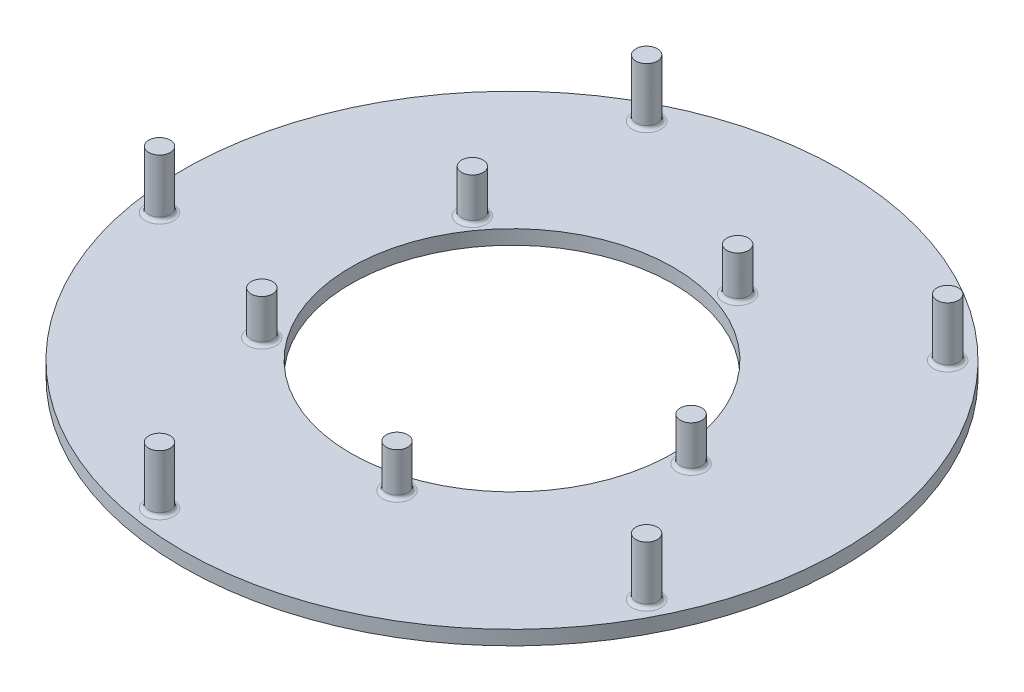
ISO-10303-21;
HEADER;
FILE_DESCRIPTION(('STEP AP214'),'2;1');
FILE_NAME('part.step','',(''),(''),'','','');
FILE_SCHEMA(('AUTOMOTIVE_DESIGN { 1 0 10303 214 1 1 1 1 }'));
ENDSEC;
DATA;
#1=APPLICATION_CONTEXT('core data for automotive mechanical design processes');
#2=APPLICATION_PROTOCOL_DEFINITION('international standard','automotive_design',2000,#1);
#3=PRODUCT_CONTEXT('',#1,'mechanical');
#4=PRODUCT('Part','Part','',(#3));
#5=PRODUCT_RELATED_PRODUCT_CATEGORY('part','',(#4));
#6=PRODUCT_DEFINITION_FORMATION('','',#4);
#7=PRODUCT_DEFINITION_CONTEXT('part definition',#1,'design');
#8=PRODUCT_DEFINITION('design','',#6,#7);
#9=PRODUCT_DEFINITION_SHAPE('','',#8);
#10=(LENGTH_UNIT() NAMED_UNIT(*) SI_UNIT(.MILLI.,.METRE.));
#11=(NAMED_UNIT(*) PLANE_ANGLE_UNIT() SI_UNIT($,.RADIAN.));
#12=(NAMED_UNIT(*) SI_UNIT($,.STERADIAN.) SOLID_ANGLE_UNIT());
#13=UNCERTAINTY_MEASURE_WITH_UNIT(LENGTH_MEASURE(1.E-05),#10,'distance_accuracy_value','');
#14=(GEOMETRIC_REPRESENTATION_CONTEXT(3) GLOBAL_UNCERTAINTY_ASSIGNED_CONTEXT((#13)) GLOBAL_UNIT_ASSIGNED_CONTEXT((#10,
#11,#12)) REPRESENTATION_CONTEXT('',''));
#15=CARTESIAN_POINT('',(0.,0.,0.));
#16=DIRECTION('',(0.,0.,1.));
#17=DIRECTION('',(1.,0.,0.));
#18=AXIS2_PLACEMENT_3D('',#15,#16,#17);
#19=CARTESIAN_POINT('',(0.,2.,0.));
#20=DIRECTION('',(0.,1.,0.));
#21=DIRECTION('',(0.,0.,1.));
#22=AXIS2_PLACEMENT_3D('',#19,#20,#21);
#23=PLANE('',#22);
#24=CARTESIAN_POINT('',(38.3132805401001,2.,19.5215914888));
#25=DIRECTION('',(0.,1.,0.));
#26=DIRECTION('',(0.,0.,1.));
#27=AXIS2_PLACEMENT_3D('',#24,#25,#26);
#28=CIRCLE('',#27,2.00000000000001);
#29=CARTESIAN_POINT('',(38.3132805401001,2.,21.5215914888));
#30=VERTEX_POINT('',#29);
#31=EDGE_CURVE('E38',#30,#30,#28,.F.);
#32=ORIENTED_EDGE('',*,*,#31,.T.);
#33=EDGE_LOOP('',(#32));
#34=FACE_BOUND('',#33,.T.);
#35=CARTESIAN_POINT('',(7.72542485937396,2.,23.7764129073788));
#36=DIRECTION('',(0.,1.,0.));
#37=DIRECTION('',(0.,0.,1.));
#38=AXIS2_PLACEMENT_3D('',#35,#36,#37);
#39=CIRCLE('',#38,2.);
#40=CARTESIAN_POINT('',(7.72542485937396,2.,25.7764129073788));
#41=VERTEX_POINT('',#40);
#42=EDGE_CURVE('E42',#41,#41,#39,.F.);
#43=ORIENTED_EDGE('',*,*,#42,.T.);
#44=EDGE_LOOP('',(#43));
#45=FACE_BOUND('',#44,.T.);
#46=CARTESIAN_POINT('',(-6.72668199672947,2.,42.470598645591));
#47=DIRECTION('',(0.,1.,0.));
#48=DIRECTION('',(0.,0.,1.));
#49=AXIS2_PLACEMENT_3D('',#46,#47,#48);
#50=CIRCLE('',#49,2.00000000000001);
#51=CARTESIAN_POINT('',(-6.72668199672947,2.,44.470598645591));
#52=VERTEX_POINT('',#51);
#53=EDGE_CURVE('E54',#52,#52,#50,.F.);
#54=ORIENTED_EDGE('',*,*,#53,.T.);
#55=EDGE_LOOP('',(#54));
#56=FACE_BOUND('',#55,.T.);
#57=CARTESIAN_POINT('',(-20.2254248593736,2.,14.694631307312));
#58=DIRECTION('',(0.,1.,0.));
#59=DIRECTION('',(0.,0.,1.));
#60=AXIS2_PLACEMENT_3D('',#57,#58,#59);
#61=CIRCLE('',#60,2.);
#62=CARTESIAN_POINT('',(-20.2254248593736,2.,16.694631307312));
#63=VERTEX_POINT('',#62);
#64=EDGE_CURVE('E57',#63,#63,#61,.F.);
#65=ORIENTED_EDGE('',*,*,#64,.T.);
#66=EDGE_LOOP('',(#65));
#67=FACE_BOUND('',#66,.T.);
#68=CARTESIAN_POINT('',(-42.4705986455909,2.,6.72668199673025));
#69=DIRECTION('',(0.,1.,0.));
#70=DIRECTION('',(0.,0.,1.));
#71=AXIS2_PLACEMENT_3D('',#68,#69,#70);
#72=CIRCLE('',#71,2.00000000000001);
#73=CARTESIAN_POINT('',(-42.4705986455909,2.,8.72668199673025));
#74=VERTEX_POINT('',#73);
#75=EDGE_CURVE('E66',#74,#74,#72,.F.);
#76=ORIENTED_EDGE('',*,*,#75,.T.);
#77=EDGE_LOOP('',(#76));
#78=FACE_BOUND('',#77,.T.);
#79=CARTESIAN_POINT('',(-20.2254248593738,2.,-14.6946313073117));
#80=DIRECTION('',(0.,1.,0.));
#81=DIRECTION('',(0.,0.,1.));
#82=AXIS2_PLACEMENT_3D('',#79,#80,#81);
#83=CIRCLE('',#82,2.);
#84=CARTESIAN_POINT('',(-20.2254248593738,2.,-12.6946313073117));
#85=VERTEX_POINT('',#84);
#86=EDGE_CURVE('E69',#85,#85,#83,.F.);
#87=ORIENTED_EDGE('',*,*,#86,.T.);
#88=EDGE_LOOP('',(#87));
#89=FACE_BOUND('',#88,.T.);
#90=CARTESIAN_POINT('',(-19.5215914888007,2.,-38.3132805400997));
#91=DIRECTION('',(0.,1.,0.));
#92=DIRECTION('',(0.,0.,1.));
#93=AXIS2_PLACEMENT_3D('',#90,#91,#92);
#94=CIRCLE('',#93,2.00000000000001);
#95=CARTESIAN_POINT('',(-19.5215914888007,2.,-36.3132805400997));
#96=VERTEX_POINT('',#95);
#97=EDGE_CURVE('E78',#96,#96,#94,.F.);
#98=ORIENTED_EDGE('',*,*,#97,.T.);
#99=EDGE_LOOP('',(#98));
#100=FACE_BOUND('',#99,.T.);
#101=CARTESIAN_POINT('',(7.72542485937362,2.,-23.7764129073789));
#102=DIRECTION('',(0.,1.,0.));
#103=DIRECTION('',(0.,0.,1.));
#104=AXIS2_PLACEMENT_3D('',#101,#102,#103);
#105=CIRCLE('',#104,2.);
#106=CARTESIAN_POINT('',(7.72542485937362,2.,-21.7764129073789));
#107=VERTEX_POINT('',#106);
#108=EDGE_CURVE('E81',#107,#107,#105,.F.);
#109=ORIENTED_EDGE('',*,*,#108,.T.);
#110=EDGE_LOOP('',(#109));
#111=FACE_BOUND('',#110,.T.);
#112=CARTESIAN_POINT('',(30.4055915910215,2.,-30.4055915910216));
#113=DIRECTION('',(0.,1.,0.));
#114=DIRECTION('',(0.,0.,1.));
#115=AXIS2_PLACEMENT_3D('',#112,#113,#114);
#116=CIRCLE('',#115,2.00000000000001);
#117=CARTESIAN_POINT('',(30.4055915910215,2.,-28.4055915910216));
#118=VERTEX_POINT('',#117);
#119=EDGE_CURVE('E90',#118,#118,#116,.F.);
#120=ORIENTED_EDGE('',*,*,#119,.T.);
#121=EDGE_LOOP('',(#120));
#122=FACE_BOUND('',#121,.T.);
#123=CARTESIAN_POINT('',(25.,2.,0.));
#124=DIRECTION('',(0.,1.,0.));
#125=DIRECTION('',(0.,0.,1.));
#126=AXIS2_PLACEMENT_3D('',#123,#124,#125);
#127=CIRCLE('',#126,2.);
#128=CARTESIAN_POINT('',(25.,2.,2.));
#129=VERTEX_POINT('',#128);
#130=EDGE_CURVE('E93',#129,#129,#127,.F.);
#131=ORIENTED_EDGE('',*,*,#130,.T.);
#132=EDGE_LOOP('',(#131));
#133=FACE_BOUND('',#132,.T.);
#134=CARTESIAN_POINT('',(0.,2.,0.));
#135=DIRECTION('',(0.,1.,0.));
#136=DIRECTION('',(0.,0.,1.));
#137=AXIS2_PLACEMENT_3D('',#134,#135,#136);
#138=CIRCLE('',#137,46.);
#139=CARTESIAN_POINT('',(0.,2.,46.));
#140=VERTEX_POINT('',#139);
#141=EDGE_CURVE('E99',#140,#140,#138,.T.);
#142=ORIENTED_EDGE('',*,*,#141,.T.);
#143=EDGE_LOOP('',(#142));
#144=FACE_BOUND('',#143,.T.);
#145=CARTESIAN_POINT('',(0.,2.,0.));
#146=DIRECTION('',(0.,1.,0.));
#147=DIRECTION('',(0.,0.,1.));
#148=AXIS2_PLACEMENT_3D('',#145,#146,#147);
#149=CIRCLE('',#148,22.5);
#150=CARTESIAN_POINT('',(0.,2.,22.5));
#151=VERTEX_POINT('',#150);
#152=EDGE_CURVE('E103',#151,#151,#149,.T.);
#153=ORIENTED_EDGE('',*,*,#152,.F.);
#154=EDGE_LOOP('',(#153));
#155=FACE_BOUND('',#154,.T.);
#156=ADVANCED_FACE('F31',(#34,#45,#56,#67,#78,#89,#100,#111,#122,#133,#144,#155),#23,.T.);
#157=CARTESIAN_POINT('',(0.,0.,0.));
#158=DIRECTION('',(0.,1.,0.));
#159=DIRECTION('',(0.,0.,1.));
#160=AXIS2_PLACEMENT_3D('',#157,#158,#159);
#161=PLANE('',#160);
#162=CARTESIAN_POINT('',(0.,0.,0.));
#163=DIRECTION('',(0.,1.,0.));
#164=DIRECTION('',(0.,0.,1.));
#165=AXIS2_PLACEMENT_3D('',#162,#163,#164);
#166=CIRCLE('',#165,46.);
#167=CARTESIAN_POINT('',(0.,0.,46.));
#168=VERTEX_POINT('',#167);
#169=EDGE_CURVE('E100',#168,#168,#166,.T.);
#170=ORIENTED_EDGE('',*,*,#169,.F.);
#171=EDGE_LOOP('',(#170));
#172=FACE_BOUND('',#171,.T.);
#173=CARTESIAN_POINT('',(0.,0.,0.));
#174=DIRECTION('',(0.,1.,0.));
#175=DIRECTION('',(0.,0.,1.));
#176=AXIS2_PLACEMENT_3D('',#173,#174,#175);
#177=CIRCLE('',#176,22.5);
#178=CARTESIAN_POINT('',(0.,0.,22.5));
#179=VERTEX_POINT('',#178);
#180=EDGE_CURVE('E106',#179,#179,#177,.T.);
#181=ORIENTED_EDGE('',*,*,#180,.T.);
#182=EDGE_LOOP('',(#181));
#183=FACE_BOUND('',#182,.T.);
#184=ADVANCED_FACE('F162',(#172,#183),#161,.F.);
#185=CARTESIAN_POINT('',(0.,2.,0.));
#186=DIRECTION('',(0.,-1.,0.));
#187=DIRECTION('',(0.,0.,-1.));
#188=AXIS2_PLACEMENT_3D('',#185,#186,#187);
#189=CYLINDRICAL_SURFACE('',#188,46.);
#190=ORIENTED_EDGE('',*,*,#141,.F.);
#191=EDGE_LOOP('',(#190));
#192=FACE_BOUND('',#191,.T.);
#193=ORIENTED_EDGE('',*,*,#169,.T.);
#194=EDGE_LOOP('',(#193));
#195=FACE_BOUND('',#194,.T.);
#196=ADVANCED_FACE('F167',(#192,#195),#189,.T.);
#197=CARTESIAN_POINT('',(0.,2.,0.));
#198=DIRECTION('',(0.,-1.,0.));
#199=DIRECTION('',(0.,0.,-1.));
#200=AXIS2_PLACEMENT_3D('',#197,#198,#199);
#201=CYLINDRICAL_SURFACE('',#200,22.5);
#202=ORIENTED_EDGE('',*,*,#152,.T.);
#203=EDGE_LOOP('',(#202));
#204=FACE_BOUND('',#203,.T.);
#205=ORIENTED_EDGE('',*,*,#180,.F.);
#206=EDGE_LOOP('',(#205));
#207=FACE_BOUND('',#206,.T.);
#208=ADVANCED_FACE('F172',(#204,#207),#201,.F.);
#209=CARTESIAN_POINT('',(25.,8.,0.));
#210=DIRECTION('',(0.,-1.,0.));
#211=DIRECTION('',(0.,0.,-1.));
#212=AXIS2_PLACEMENT_3D('',#209,#210,#211);
#213=CYLINDRICAL_SURFACE('',#212,1.5);
#214=CARTESIAN_POINT('',(25.,2.5,0.));
#215=DIRECTION('',(0.,1.,0.));
#216=DIRECTION('',(0.,0.,1.));
#217=AXIS2_PLACEMENT_3D('',#214,#215,#216);
#218=CIRCLE('',#217,1.5);
#219=CARTESIAN_POINT('',(25.,2.5,1.5));
#220=VERTEX_POINT('',#219);
#221=EDGE_CURVE('E87',#220,#220,#218,.T.);
#222=ORIENTED_EDGE('',*,*,#221,.T.);
#223=EDGE_LOOP('',(#222));
#224=FACE_BOUND('',#223,.T.);
#225=CARTESIAN_POINT('',(25.,8.,0.));
#226=DIRECTION('',(0.,1.,0.));
#227=DIRECTION('',(0.,0.,1.));
#228=AXIS2_PLACEMENT_3D('',#225,#226,#227);
#229=CIRCLE('',#228,1.5);
#230=CARTESIAN_POINT('',(25.,8.,1.5));
#231=VERTEX_POINT('',#230);
#232=EDGE_CURVE('E109',#231,#231,#229,.T.);
#233=ORIENTED_EDGE('',*,*,#232,.F.);
#234=EDGE_LOOP('',(#233));
#235=FACE_BOUND('',#234,.T.);
#236=ADVANCED_FACE('F246',(#224,#235),#213,.T.);
#237=CARTESIAN_POINT('',(25.,8.,0.));
#238=DIRECTION('',(0.,1.,0.));
#239=DIRECTION('',(0.,0.,1.));
#240=AXIS2_PLACEMENT_3D('',#237,#238,#239);
#241=PLANE('',#240);
#242=ORIENTED_EDGE('',*,*,#232,.T.);
#243=EDGE_LOOP('',(#242));
#244=FACE_BOUND('',#243,.T.);
#245=ADVANCED_FACE('F252',(#244),#241,.T.);
#246=CARTESIAN_POINT('',(30.4055915910215,8.,-30.4055915910216));
#247=DIRECTION('',(0.,-1.,0.));
#248=DIRECTION('',(0.,0.,-1.));
#249=AXIS2_PLACEMENT_3D('',#246,#247,#248);
#250=CYLINDRICAL_SURFACE('',#249,1.50000000000001);
#251=CARTESIAN_POINT('',(30.4055915910215,2.5,-30.4055915910216));
#252=DIRECTION('',(0.,1.,0.));
#253=DIRECTION('',(0.,0.,1.));
#254=AXIS2_PLACEMENT_3D('',#251,#252,#253);
#255=CIRCLE('',#254,1.50000000000001);
#256=CARTESIAN_POINT('',(30.4055915910215,2.5,-28.9055915910216));
#257=VERTEX_POINT('',#256);
#258=EDGE_CURVE('E96',#257,#257,#255,.T.);
#259=ORIENTED_EDGE('',*,*,#258,.T.);
#260=EDGE_LOOP('',(#259));
#261=FACE_BOUND('',#260,.T.);
#262=CARTESIAN_POINT('',(30.4055915910215,10.,-30.4055915910216));
#263=DIRECTION('',(0.,1.,0.));
#264=DIRECTION('',(0.,0.,1.));
#265=AXIS2_PLACEMENT_3D('',#262,#263,#264);
#266=CIRCLE('',#265,1.50000000000001);
#267=CARTESIAN_POINT('',(30.4055915910215,10.,-28.9055915910216));
#268=VERTEX_POINT('',#267);
#269=EDGE_CURVE('E114',#268,#268,#266,.T.);
#270=ORIENTED_EDGE('',*,*,#269,.F.);
#271=EDGE_LOOP('',(#270));
#272=FACE_BOUND('',#271,.T.);
#273=ADVANCED_FACE('F182',(#261,#272),#250,.T.);
#274=CARTESIAN_POINT('',(30.4055915910215,2.5,-30.4055915910216));
#275=DIRECTION('',(0.,1.,0.));
#276=DIRECTION('',(0.,0.,1.));
#277=AXIS2_PLACEMENT_3D('',#274,#275,#276);
#278=TOROIDAL_SURFACE('',#277,2.00000000000001,0.5);
#279=ORIENTED_EDGE('',*,*,#119,.F.);
#280=EDGE_LOOP('',(#279));
#281=FACE_BOUND('',#280,.T.);
#282=ORIENTED_EDGE('',*,*,#258,.F.);
#283=EDGE_LOOP('',(#282));
#284=FACE_BOUND('',#283,.T.);
#285=ADVANCED_FACE('F178',(#281,#284),#278,.F.);
#286=CARTESIAN_POINT('',(25.,2.5,0.));
#287=DIRECTION('',(0.,1.,0.));
#288=DIRECTION('',(0.,0.,1.));
#289=AXIS2_PLACEMENT_3D('',#286,#287,#288);
#290=TOROIDAL_SURFACE('',#289,2.,0.5);
#291=ORIENTED_EDGE('',*,*,#130,.F.);
#292=EDGE_LOOP('',(#291));
#293=FACE_BOUND('',#292,.T.);
#294=ORIENTED_EDGE('',*,*,#221,.F.);
#295=EDGE_LOOP('',(#294));
#296=FACE_BOUND('',#295,.T.);
#297=ADVANCED_FACE('F181',(#293,#296),#290,.F.);
#298=CARTESIAN_POINT('',(30.4055915910215,10.,-30.4055915910216));
#299=DIRECTION('',(0.,1.,0.));
#300=DIRECTION('',(0.,0.,1.));
#301=AXIS2_PLACEMENT_3D('',#298,#299,#300);
#302=PLANE('',#301);
#303=ORIENTED_EDGE('',*,*,#269,.T.);
#304=EDGE_LOOP('',(#303));
#305=FACE_BOUND('',#304,.T.);
#306=ADVANCED_FACE('F185',(#305),#302,.T.);
#307=CARTESIAN_POINT('',(7.72542485937362,8.,-23.7764129073789));
#308=DIRECTION('',(0.,-1.,0.));
#309=DIRECTION('',(0.,0.,-1.));
#310=AXIS2_PLACEMENT_3D('',#307,#308,#309);
#311=CYLINDRICAL_SURFACE('',#310,1.5);
#312=CARTESIAN_POINT('',(7.72542485937362,2.5,-23.7764129073789));
#313=DIRECTION('',(0.,1.,0.));
#314=DIRECTION('',(0.,0.,1.));
#315=AXIS2_PLACEMENT_3D('',#312,#313,#314);
#316=CIRCLE('',#315,1.5);
#317=CARTESIAN_POINT('',(7.72542485937362,2.5,-22.2764129073789));
#318=VERTEX_POINT('',#317);
#319=EDGE_CURVE('E75',#318,#318,#316,.T.);
#320=ORIENTED_EDGE('',*,*,#319,.T.);
#321=EDGE_LOOP('',(#320));
#322=FACE_BOUND('',#321,.T.);
#323=CARTESIAN_POINT('',(7.72542485937362,8.,-23.7764129073789));
#324=DIRECTION('',(0.,1.,0.));
#325=DIRECTION('',(0.951056516295155,0.,0.309016994374945));
#326=AXIS2_PLACEMENT_3D('',#323,#324,#325);
#327=CIRCLE('',#326,1.5);
#328=CARTESIAN_POINT('',(9.15200963381635,8.,-23.3128874158164));
#329=VERTEX_POINT('',#328);
#330=EDGE_CURVE('E117',#329,#329,#327,.T.);
#331=ORIENTED_EDGE('',*,*,#330,.F.);
#332=EDGE_LOOP('',(#331));
#333=FACE_BOUND('',#332,.T.);
#334=ADVANCED_FACE('F266',(#322,#333),#311,.T.);
#335=CARTESIAN_POINT('',(7.72542485937362,8.,-23.7764129073789));
#336=DIRECTION('',(0.,1.,0.));
#337=DIRECTION('',(0.951056516295155,0.,0.309016994374945));
#338=AXIS2_PLACEMENT_3D('',#335,#336,#337);
#339=PLANE('',#338);
#340=ORIENTED_EDGE('',*,*,#330,.T.);
#341=EDGE_LOOP('',(#340));
#342=FACE_BOUND('',#341,.T.);
#343=ADVANCED_FACE('F270',(#342),#339,.T.);
#344=CARTESIAN_POINT('',(-19.5215914888007,8.,-38.3132805400997));
#345=DIRECTION('',(0.,-1.,0.));
#346=DIRECTION('',(0.,0.,-1.));
#347=AXIS2_PLACEMENT_3D('',#344,#345,#346);
#348=CYLINDRICAL_SURFACE('',#347,1.50000000000001);
#349=CARTESIAN_POINT('',(-19.5215914888007,2.5,-38.3132805400997));
#350=DIRECTION('',(0.,1.,0.));
#351=DIRECTION('',(0.,0.,1.));
#352=AXIS2_PLACEMENT_3D('',#349,#350,#351);
#353=CIRCLE('',#352,1.50000000000001);
#354=CARTESIAN_POINT('',(-19.5215914888007,2.5,-36.8132805400997));
#355=VERTEX_POINT('',#354);
#356=EDGE_CURVE('E84',#355,#355,#353,.T.);
#357=ORIENTED_EDGE('',*,*,#356,.T.);
#358=EDGE_LOOP('',(#357));
#359=FACE_BOUND('',#358,.T.);
#360=CARTESIAN_POINT('',(-19.5215914888007,10.,-38.3132805400997));
#361=DIRECTION('',(0.,1.,0.));
#362=DIRECTION('',(0.951056516295155,0.,0.309016994374945));
#363=AXIS2_PLACEMENT_3D('',#360,#361,#362);
#364=CIRCLE('',#363,1.50000000000001);
#365=CARTESIAN_POINT('',(-18.095006714358,10.,-37.8497550485373));
#366=VERTEX_POINT('',#365);
#367=EDGE_CURVE('E129',#366,#366,#364,.T.);
#368=ORIENTED_EDGE('',*,*,#367,.F.);
#369=EDGE_LOOP('',(#368));
#370=FACE_BOUND('',#369,.T.);
#371=ADVANCED_FACE('F274',(#359,#370),#348,.T.);
#372=CARTESIAN_POINT('',(-20.2254248593738,8.,-14.6946313073117));
#373=DIRECTION('',(0.,-1.,0.));
#374=DIRECTION('',(0.,0.,-1.));
#375=AXIS2_PLACEMENT_3D('',#372,#373,#374);
#376=CYLINDRICAL_SURFACE('',#375,1.5);
#377=CARTESIAN_POINT('',(-20.2254248593738,2.5,-14.6946313073117));
#378=DIRECTION('',(0.,1.,0.));
#379=DIRECTION('',(0.,0.,1.));
#380=AXIS2_PLACEMENT_3D('',#377,#378,#379);
#381=CIRCLE('',#380,1.5);
#382=CARTESIAN_POINT('',(-20.2254248593738,2.5,-13.1946313073117));
#383=VERTEX_POINT('',#382);
#384=EDGE_CURVE('E63',#383,#383,#381,.T.);
#385=ORIENTED_EDGE('',*,*,#384,.T.);
#386=EDGE_LOOP('',(#385));
#387=FACE_BOUND('',#386,.T.);
#388=CARTESIAN_POINT('',(-20.2254248593738,8.,-14.6946313073117));
#389=DIRECTION('',(0.,1.,0.));
#390=DIRECTION('',(0.587785252292469,0.,-0.809016994374951));
#391=AXIS2_PLACEMENT_3D('',#388,#389,#390);
#392=CIRCLE('',#391,1.5);
#393=CARTESIAN_POINT('',(-19.3437469809351,8.,-15.9081567988741));
#394=VERTEX_POINT('',#393);
#395=EDGE_CURVE('E120',#394,#394,#392,.T.);
#396=ORIENTED_EDGE('',*,*,#395,.F.);
#397=EDGE_LOOP('',(#396));
#398=FACE_BOUND('',#397,.T.);
#399=ADVANCED_FACE('F278',(#387,#398),#376,.T.);
#400=CARTESIAN_POINT('',(-20.2254248593738,8.,-14.6946313073117));
#401=DIRECTION('',(0.,1.,0.));
#402=DIRECTION('',(0.587785252292469,0.,-0.809016994374951));
#403=AXIS2_PLACEMENT_3D('',#400,#401,#402);
#404=PLANE('',#403);
#405=ORIENTED_EDGE('',*,*,#395,.T.);
#406=EDGE_LOOP('',(#405));
#407=FACE_BOUND('',#406,.T.);
#408=ADVANCED_FACE('F282',(#407),#404,.T.);
#409=CARTESIAN_POINT('',(-42.4705986455909,8.,6.72668199673025));
#410=DIRECTION('',(0.,-1.,0.));
#411=DIRECTION('',(0.,0.,-1.));
#412=AXIS2_PLACEMENT_3D('',#409,#410,#411);
#413=CYLINDRICAL_SURFACE('',#412,1.50000000000001);
#414=CARTESIAN_POINT('',(-42.4705986455909,2.5,6.72668199673025));
#415=DIRECTION('',(0.,1.,0.));
#416=DIRECTION('',(0.,0.,1.));
#417=AXIS2_PLACEMENT_3D('',#414,#415,#416);
#418=CIRCLE('',#417,1.50000000000001);
#419=CARTESIAN_POINT('',(-42.4705986455909,2.5,8.22668199673026));
#420=VERTEX_POINT('',#419);
#421=EDGE_CURVE('E72',#420,#420,#418,.T.);
#422=ORIENTED_EDGE('',*,*,#421,.T.);
#423=EDGE_LOOP('',(#422));
#424=FACE_BOUND('',#423,.T.);
#425=CARTESIAN_POINT('',(-42.4705986455909,10.,6.72668199673025));
#426=DIRECTION('',(0.,1.,0.));
#427=DIRECTION('',(0.587785252292469,0.,-0.809016994374951));
#428=AXIS2_PLACEMENT_3D('',#425,#426,#427);
#429=CIRCLE('',#428,1.50000000000001);
#430=CARTESIAN_POINT('',(-41.5889207671522,10.,5.51315650516782));
#431=VERTEX_POINT('',#430);
#432=EDGE_CURVE('E132',#431,#431,#429,.T.);
#433=ORIENTED_EDGE('',*,*,#432,.F.);
#434=EDGE_LOOP('',(#433));
#435=FACE_BOUND('',#434,.T.);
#436=ADVANCED_FACE('F286',(#424,#435),#413,.T.);
#437=CARTESIAN_POINT('',(-20.2254248593736,8.,14.694631307312));
#438=DIRECTION('',(0.,-1.,0.));
#439=DIRECTION('',(0.,0.,-1.));
#440=AXIS2_PLACEMENT_3D('',#437,#438,#439);
#441=CYLINDRICAL_SURFACE('',#440,1.5);
#442=CARTESIAN_POINT('',(-20.2254248593736,2.5,14.694631307312));
#443=DIRECTION('',(0.,1.,0.));
#444=DIRECTION('',(0.,0.,1.));
#445=AXIS2_PLACEMENT_3D('',#442,#443,#444);
#446=CIRCLE('',#445,1.5);
#447=CARTESIAN_POINT('',(-20.2254248593736,2.5,16.194631307312));
#448=VERTEX_POINT('',#447);
#449=EDGE_CURVE('E51',#448,#448,#446,.T.);
#450=ORIENTED_EDGE('',*,*,#449,.T.);
#451=EDGE_LOOP('',(#450));
#452=FACE_BOUND('',#451,.T.);
#453=CARTESIAN_POINT('',(-20.2254248593736,8.,14.694631307312));
#454=DIRECTION('',(0.,1.,0.));
#455=DIRECTION('',(-0.58778525229248,0.,-0.809016994374942));
#456=AXIS2_PLACEMENT_3D('',#453,#454,#455);
#457=CIRCLE('',#456,1.5);
#458=CARTESIAN_POINT('',(-21.1071027378123,8.,13.4811058157496));
#459=VERTEX_POINT('',#458);
#460=EDGE_CURVE('E123',#459,#459,#457,.T.);
#461=ORIENTED_EDGE('',*,*,#460,.F.);
#462=EDGE_LOOP('',(#461));
#463=FACE_BOUND('',#462,.T.);
#464=ADVANCED_FACE('F290',(#452,#463),#441,.T.);
#465=CARTESIAN_POINT('',(-20.2254248593736,8.,14.694631307312));
#466=DIRECTION('',(0.,1.,0.));
#467=DIRECTION('',(-0.58778525229248,0.,-0.809016994374942));
#468=AXIS2_PLACEMENT_3D('',#465,#466,#467);
#469=PLANE('',#468);
#470=ORIENTED_EDGE('',*,*,#460,.T.);
#471=EDGE_LOOP('',(#470));
#472=FACE_BOUND('',#471,.T.);
#473=ADVANCED_FACE('F294',(#472),#469,.T.);
#474=CARTESIAN_POINT('',(-6.72668199672947,8.,42.470598645591));
#475=DIRECTION('',(0.,-1.,0.));
#476=DIRECTION('',(0.,0.,-1.));
#477=AXIS2_PLACEMENT_3D('',#474,#475,#476);
#478=CYLINDRICAL_SURFACE('',#477,1.50000000000001);
#479=CARTESIAN_POINT('',(-6.72668199672947,2.5,42.470598645591));
#480=DIRECTION('',(0.,1.,0.));
#481=DIRECTION('',(0.,0.,1.));
#482=AXIS2_PLACEMENT_3D('',#479,#480,#481);
#483=CIRCLE('',#482,1.50000000000001);
#484=CARTESIAN_POINT('',(-6.72668199672947,2.5,43.970598645591));
#485=VERTEX_POINT('',#484);
#486=EDGE_CURVE('E60',#485,#485,#483,.T.);
#487=ORIENTED_EDGE('',*,*,#486,.T.);
#488=EDGE_LOOP('',(#487));
#489=FACE_BOUND('',#488,.T.);
#490=CARTESIAN_POINT('',(-6.72668199672947,10.,42.470598645591));
#491=DIRECTION('',(0.,1.,0.));
#492=DIRECTION('',(-0.58778525229248,0.,-0.809016994374942));
#493=AXIS2_PLACEMENT_3D('',#490,#491,#492);
#494=CIRCLE('',#493,1.50000000000001);
#495=CARTESIAN_POINT('',(-7.6083598751682,10.,41.2570731540286));
#496=VERTEX_POINT('',#495);
#497=EDGE_CURVE('E135',#496,#496,#494,.T.);
#498=ORIENTED_EDGE('',*,*,#497,.F.);
#499=EDGE_LOOP('',(#498));
#500=FACE_BOUND('',#499,.T.);
#501=ADVANCED_FACE('F298',(#489,#500),#478,.T.);
#502=CARTESIAN_POINT('',(7.72542485937396,8.,23.7764129073788));
#503=DIRECTION('',(0.,-1.,0.));
#504=DIRECTION('',(0.,0.,-1.));
#505=AXIS2_PLACEMENT_3D('',#502,#503,#504);
#506=CYLINDRICAL_SURFACE('',#505,1.5);
#507=CARTESIAN_POINT('',(7.72542485937396,2.5,23.7764129073788));
#508=DIRECTION('',(0.,1.,0.));
#509=DIRECTION('',(0.,0.,1.));
#510=AXIS2_PLACEMENT_3D('',#507,#508,#509);
#511=CIRCLE('',#510,1.5);
#512=CARTESIAN_POINT('',(7.72542485937396,2.5,25.2764129073788));
#513=VERTEX_POINT('',#512);
#514=EDGE_CURVE('E10',#513,#513,#511,.T.);
#515=ORIENTED_EDGE('',*,*,#514,.T.);
#516=EDGE_LOOP('',(#515));
#517=FACE_BOUND('',#516,.T.);
#518=CARTESIAN_POINT('',(7.72542485937396,8.,23.7764129073788));
#519=DIRECTION('',(0.,1.,0.));
#520=DIRECTION('',(-0.95105651629515,0.,0.309016994374958));
#521=AXIS2_PLACEMENT_3D('',#518,#519,#520);
#522=CIRCLE('',#521,1.5);
#523=CARTESIAN_POINT('',(6.29884008493123,8.,24.2399383989412));
#524=VERTEX_POINT('',#523);
#525=EDGE_CURVE('E126',#524,#524,#522,.T.);
#526=ORIENTED_EDGE('',*,*,#525,.F.);
#527=EDGE_LOOP('',(#526));
#528=FACE_BOUND('',#527,.T.);
#529=ADVANCED_FACE('F157',(#517,#528),#506,.T.);
#530=CARTESIAN_POINT('',(7.72542485937396,8.,23.7764129073788));
#531=DIRECTION('',(0.,1.,0.));
#532=DIRECTION('',(-0.95105651629515,0.,0.309016994374958));
#533=AXIS2_PLACEMENT_3D('',#530,#531,#532);
#534=PLANE('',#533);
#535=ORIENTED_EDGE('',*,*,#525,.T.);
#536=EDGE_LOOP('',(#535));
#537=FACE_BOUND('',#536,.T.);
#538=ADVANCED_FACE('F147',(#537),#534,.T.);
#539=CARTESIAN_POINT('',(38.3132805401001,8.,19.5215914888));
#540=DIRECTION('',(0.,-1.,0.));
#541=DIRECTION('',(0.,0.,-1.));
#542=AXIS2_PLACEMENT_3D('',#539,#540,#541);
#543=CYLINDRICAL_SURFACE('',#542,1.50000000000001);
#544=CARTESIAN_POINT('',(38.3132805401001,2.5,19.5215914888));
#545=DIRECTION('',(0.,1.,0.));
#546=DIRECTION('',(0.,0.,1.));
#547=AXIS2_PLACEMENT_3D('',#544,#545,#546);
#548=CIRCLE('',#547,1.50000000000001);
#549=CARTESIAN_POINT('',(38.3132805401001,2.5,21.0215914888));
#550=VERTEX_POINT('',#549);
#551=EDGE_CURVE('E46',#550,#550,#548,.T.);
#552=ORIENTED_EDGE('',*,*,#551,.T.);
#553=EDGE_LOOP('',(#552));
#554=FACE_BOUND('',#553,.T.);
#555=CARTESIAN_POINT('',(38.3132805401001,10.,19.5215914888));
#556=DIRECTION('',(0.,1.,0.));
#557=DIRECTION('',(-0.95105651629515,0.,0.309016994374958));
#558=AXIS2_PLACEMENT_3D('',#555,#556,#557);
#559=CIRCLE('',#558,1.50000000000001);
#560=CARTESIAN_POINT('',(36.8866957656573,10.,19.9851169803624));
#561=VERTEX_POINT('',#560);
#562=EDGE_CURVE('E138',#561,#561,#559,.T.);
#563=ORIENTED_EDGE('',*,*,#562,.F.);
#564=EDGE_LOOP('',(#563));
#565=FACE_BOUND('',#564,.T.);
#566=ADVANCED_FACE('F144',(#554,#565),#543,.T.);
#567=CARTESIAN_POINT('',(-19.5215914888007,2.5,-38.3132805400997));
#568=DIRECTION('',(0.,1.,0.));
#569=DIRECTION('',(0.,0.,1.));
#570=AXIS2_PLACEMENT_3D('',#567,#568,#569);
#571=TOROIDAL_SURFACE('',#570,2.00000000000001,0.5);
#572=ORIENTED_EDGE('',*,*,#97,.F.);
#573=EDGE_LOOP('',(#572));
#574=FACE_BOUND('',#573,.T.);
#575=ORIENTED_EDGE('',*,*,#356,.F.);
#576=EDGE_LOOP('',(#575));
#577=FACE_BOUND('',#576,.T.);
#578=ADVANCED_FACE('F146',(#574,#577),#571,.F.);
#579=CARTESIAN_POINT('',(7.72542485937362,2.5,-23.7764129073789));
#580=DIRECTION('',(0.,1.,0.));
#581=DIRECTION('',(0.,0.,1.));
#582=AXIS2_PLACEMENT_3D('',#579,#580,#581);
#583=TOROIDAL_SURFACE('',#582,2.,0.5);
#584=ORIENTED_EDGE('',*,*,#108,.F.);
#585=EDGE_LOOP('',(#584));
#586=FACE_BOUND('',#585,.T.);
#587=ORIENTED_EDGE('',*,*,#319,.F.);
#588=EDGE_LOOP('',(#587));
#589=FACE_BOUND('',#588,.T.);
#590=ADVANCED_FACE('F154',(#586,#589),#583,.F.);
#591=CARTESIAN_POINT('',(-42.4705986455909,2.5,6.72668199673025));
#592=DIRECTION('',(0.,1.,0.));
#593=DIRECTION('',(0.,0.,1.));
#594=AXIS2_PLACEMENT_3D('',#591,#592,#593);
#595=TOROIDAL_SURFACE('',#594,2.00000000000001,0.5);
#596=ORIENTED_EDGE('',*,*,#75,.F.);
#597=EDGE_LOOP('',(#596));
#598=FACE_BOUND('',#597,.T.);
#599=ORIENTED_EDGE('',*,*,#421,.F.);
#600=EDGE_LOOP('',(#599));
#601=FACE_BOUND('',#600,.T.);
#602=ADVANCED_FACE('F190',(#598,#601),#595,.F.);
#603=CARTESIAN_POINT('',(-20.2254248593738,2.5,-14.6946313073117));
#604=DIRECTION('',(0.,1.,0.));
#605=DIRECTION('',(0.,0.,1.));
#606=AXIS2_PLACEMENT_3D('',#603,#604,#605);
#607=TOROIDAL_SURFACE('',#606,2.,0.5);
#608=ORIENTED_EDGE('',*,*,#86,.F.);
#609=EDGE_LOOP('',(#608));
#610=FACE_BOUND('',#609,.T.);
#611=ORIENTED_EDGE('',*,*,#384,.F.);
#612=EDGE_LOOP('',(#611));
#613=FACE_BOUND('',#612,.T.);
#614=ADVANCED_FACE('F194',(#610,#613),#607,.F.);
#615=CARTESIAN_POINT('',(-6.72668199672947,2.5,42.470598645591));
#616=DIRECTION('',(0.,1.,0.));
#617=DIRECTION('',(0.,0.,1.));
#618=AXIS2_PLACEMENT_3D('',#615,#616,#617);
#619=TOROIDAL_SURFACE('',#618,2.00000000000001,0.5);
#620=ORIENTED_EDGE('',*,*,#53,.F.);
#621=EDGE_LOOP('',(#620));
#622=FACE_BOUND('',#621,.T.);
#623=ORIENTED_EDGE('',*,*,#486,.F.);
#624=EDGE_LOOP('',(#623));
#625=FACE_BOUND('',#624,.T.);
#626=ADVANCED_FACE('F198',(#622,#625),#619,.F.);
#627=CARTESIAN_POINT('',(-20.2254248593736,2.5,14.694631307312));
#628=DIRECTION('',(0.,1.,0.));
#629=DIRECTION('',(0.,0.,1.));
#630=AXIS2_PLACEMENT_3D('',#627,#628,#629);
#631=TOROIDAL_SURFACE('',#630,2.,0.5);
#632=ORIENTED_EDGE('',*,*,#64,.F.);
#633=EDGE_LOOP('',(#632));
#634=FACE_BOUND('',#633,.T.);
#635=ORIENTED_EDGE('',*,*,#449,.F.);
#636=EDGE_LOOP('',(#635));
#637=FACE_BOUND('',#636,.T.);
#638=ADVANCED_FACE('F202',(#634,#637),#631,.F.);
#639=CARTESIAN_POINT('',(38.3132805401001,2.5,19.5215914888));
#640=DIRECTION('',(0.,1.,0.));
#641=DIRECTION('',(0.,0.,1.));
#642=AXIS2_PLACEMENT_3D('',#639,#640,#641);
#643=TOROIDAL_SURFACE('',#642,2.00000000000001,0.5);
#644=ORIENTED_EDGE('',*,*,#31,.F.);
#645=EDGE_LOOP('',(#644));
#646=FACE_BOUND('',#645,.T.);
#647=ORIENTED_EDGE('',*,*,#551,.F.);
#648=EDGE_LOOP('',(#647));
#649=FACE_BOUND('',#648,.T.);
#650=ADVANCED_FACE('F205',(#646,#649),#643,.F.);
#651=CARTESIAN_POINT('',(7.72542485937396,2.5,23.7764129073788));
#652=DIRECTION('',(0.,1.,0.));
#653=DIRECTION('',(0.,0.,1.));
#654=AXIS2_PLACEMENT_3D('',#651,#652,#653);
#655=TOROIDAL_SURFACE('',#654,2.,0.5);
#656=ORIENTED_EDGE('',*,*,#42,.F.);
#657=EDGE_LOOP('',(#656));
#658=FACE_BOUND('',#657,.T.);
#659=ORIENTED_EDGE('',*,*,#514,.F.);
#660=EDGE_LOOP('',(#659));
#661=FACE_BOUND('',#660,.T.);
#662=ADVANCED_FACE('F33',(#658,#661),#655,.F.);
#663=CARTESIAN_POINT('',(-19.5215914888007,10.,-38.3132805400997));
#664=DIRECTION('',(0.,1.,0.));
#665=DIRECTION('',(0.951056516295155,0.,0.309016994374945));
#666=AXIS2_PLACEMENT_3D('',#663,#664,#665);
#667=PLANE('',#666);
#668=ORIENTED_EDGE('',*,*,#367,.T.);
#669=EDGE_LOOP('',(#668));
#670=FACE_BOUND('',#669,.T.);
#671=ADVANCED_FACE('F212',(#670),#667,.T.);
#672=CARTESIAN_POINT('',(-42.4705986455909,10.,6.72668199673025));
#673=DIRECTION('',(0.,1.,0.));
#674=DIRECTION('',(0.587785252292469,0.,-0.809016994374951));
#675=AXIS2_PLACEMENT_3D('',#672,#673,#674);
#676=PLANE('',#675);
#677=ORIENTED_EDGE('',*,*,#432,.T.);
#678=EDGE_LOOP('',(#677));
#679=FACE_BOUND('',#678,.T.);
#680=ADVANCED_FACE('F219',(#679),#676,.T.);
#681=CARTESIAN_POINT('',(-6.72668199672947,10.,42.470598645591));
#682=DIRECTION('',(0.,1.,0.));
#683=DIRECTION('',(-0.58778525229248,0.,-0.809016994374942));
#684=AXIS2_PLACEMENT_3D('',#681,#682,#683);
#685=PLANE('',#684);
#686=ORIENTED_EDGE('',*,*,#497,.T.);
#687=EDGE_LOOP('',(#686));
#688=FACE_BOUND('',#687,.T.);
#689=ADVANCED_FACE('F380',(#688),#685,.T.);
#690=CARTESIAN_POINT('',(38.3132805401001,10.,19.5215914888));
#691=DIRECTION('',(0.,1.,0.));
#692=DIRECTION('',(-0.95105651629515,0.,0.309016994374958));
#693=AXIS2_PLACEMENT_3D('',#690,#691,#692);
#694=PLANE('',#693);
#695=ORIENTED_EDGE('',*,*,#562,.T.);
#696=EDGE_LOOP('',(#695));
#697=FACE_BOUND('',#696,.T.);
#698=ADVANCED_FACE('F142',(#697),#694,.T.);
#699=CLOSED_SHELL('',(#156,#184,#196,#208,#236,#245,#273,#285,#297,#306,#334,#343,#371,#399,
#408,#436,#464,#473,#501,#529,#538,#566,#578,#590,#602,#614,#626,#638,#650,#662,#671,#680,#689,#698));
#700=MANIFOLD_SOLID_BREP('B2',#699);
#701=ADVANCED_BREP_SHAPE_REPRESENTATION('',(#18,#700),#14);
#702=SHAPE_DEFINITION_REPRESENTATION(#9,#701);
ENDSEC;
END-ISO-10303-21;
